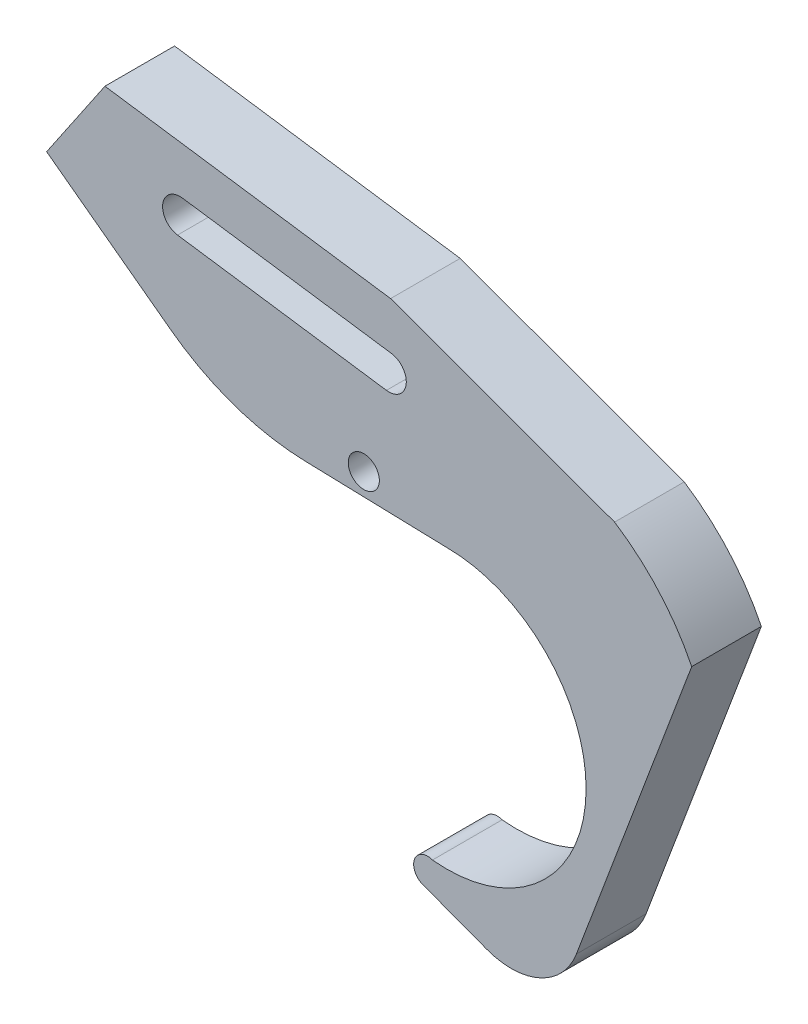
ISO-10303-21;
HEADER;
FILE_DESCRIPTION(('STEP AP214'),'2;1');
FILE_NAME('part.step','',(''),(''),'','','');
FILE_SCHEMA(('AUTOMOTIVE_DESIGN { 1 0 10303 214 1 1 1 1 }'));
ENDSEC;
DATA;
#1=APPLICATION_CONTEXT('core data for automotive mechanical design processes');
#2=APPLICATION_PROTOCOL_DEFINITION('international standard','automotive_design',2000,#1);
#3=PRODUCT_CONTEXT('',#1,'mechanical');
#4=PRODUCT('Part','Part','',(#3));
#5=PRODUCT_RELATED_PRODUCT_CATEGORY('part','',(#4));
#6=PRODUCT_DEFINITION_FORMATION('','',#4);
#7=PRODUCT_DEFINITION_CONTEXT('part definition',#1,'design');
#8=PRODUCT_DEFINITION('design','',#6,#7);
#9=PRODUCT_DEFINITION_SHAPE('','',#8);
#10=(LENGTH_UNIT() NAMED_UNIT(*) SI_UNIT(.MILLI.,.METRE.));
#11=(NAMED_UNIT(*) PLANE_ANGLE_UNIT() SI_UNIT($,.RADIAN.));
#12=(NAMED_UNIT(*) SI_UNIT($,.STERADIAN.) SOLID_ANGLE_UNIT());
#13=UNCERTAINTY_MEASURE_WITH_UNIT(LENGTH_MEASURE(1.E-05),#10,'distance_accuracy_value','');
#14=(GEOMETRIC_REPRESENTATION_CONTEXT(3) GLOBAL_UNCERTAINTY_ASSIGNED_CONTEXT((#13)) GLOBAL_UNIT_ASSIGNED_CONTEXT((#10,
#11,#12)) REPRESENTATION_CONTEXT('',''));
#15=CARTESIAN_POINT('',(0.,0.,0.));
#16=DIRECTION('',(0.,0.,1.));
#17=DIRECTION('',(1.,0.,0.));
#18=AXIS2_PLACEMENT_3D('',#15,#16,#17);
#19=CARTESIAN_POINT('',(44.5003851994904,32.9740608625398,12.7));
#20=DIRECTION('',(0.,0.,1.));
#21=DIRECTION('',(1.,0.,0.));
#22=AXIS2_PLACEMENT_3D('',#19,#20,#21);
#23=PLANE('',#22);
#24=DIRECTION('',(-0.56150006442407,-0.827476693116952,0.));
#25=VECTOR('',#24,1.);
#26=CARTESIAN_POINT('',(-37.4522239692314,73.1063917914295,12.7));
#27=LINE('',#26,#25);
#28=CARTESIAN_POINT('',(-26.824587007676,88.7682277301582,12.7));
#29=VERTEX_POINT('',#28);
#30=CARTESIAN_POINT('',(-37.4522239692314,73.1063917914295,12.7));
#31=VERTEX_POINT('',#30);
#32=EDGE_CURVE('E211',#29,#31,#27,.T.);
#33=ORIENTED_EDGE('',*,*,#32,.T.);
#34=DIRECTION('',(0.802882803656803,-0.596136900042424,0.));
#35=VECTOR('',#34,1.);
#36=CARTESIAN_POINT('',(-14.8197594877197,56.3018878776853,12.7));
#37=LINE('',#36,#35);
#38=CARTESIAN_POINT('',(-14.8197594877197,56.3018878776853,12.7));
#39=VERTEX_POINT('',#38);
#40=EDGE_CURVE('E215',#31,#39,#37,.T.);
#41=ORIENTED_EDGE('',*,*,#40,.T.);
#42=CARTESIAN_POINT('',(10.9214318561123,90.9703673395859,12.7));
#43=DIRECTION('',(0.,0.,1.));
#44=DIRECTION('',(-1.,0.,0.));
#45=AXIS2_PLACEMENT_3D('',#42,#43,#44);
#46=CIRCLE('',#45,43.18);
#47=CARTESIAN_POINT('',(9.6960610088386,47.8077577534331,12.7));
#48=VERTEX_POINT('',#47);
#49=EDGE_CURVE('E219',#39,#48,#46,.T.);
#50=ORIENTED_EDGE('',*,*,#49,.T.);
#51=DIRECTION('',(0.999597257669125,-0.0283782039665097,0.));
#52=VECTOR('',#51,1.);
#53=CARTESIAN_POINT('',(35.5396463925959,47.074067728156,12.7));
#54=LINE('',#53,#52);
#55=CARTESIAN_POINT('',(35.5396463925959,47.074067728156,12.7));
#56=VERTEX_POINT('',#55);
#57=EDGE_CURVE('E222',#48,#56,#54,.T.);
#58=ORIENTED_EDGE('',*,*,#57,.T.);
#59=CARTESIAN_POINT('',(35.5396463925959,21.674067728156,12.7));
#60=DIRECTION('',(0.,0.,-1.));
#61=DIRECTION('',(1.,0.,0.));
#62=AXIS2_PLACEMENT_3D('',#59,#60,#61);
#63=CIRCLE('',#62,25.4);
#64=CARTESIAN_POINT('',(32.9208078840981,-3.59056535578976,12.7));
#65=VERTEX_POINT('',#64);
#66=EDGE_CURVE('E225',#56,#65,#63,.T.);
#67=ORIENTED_EDGE('',*,*,#66,.T.);
#68=CARTESIAN_POINT('',(32.0265492652429,-5.9679381752279,12.7));
#69=DIRECTION('',(0.,0.,1.));
#70=DIRECTION('',(1.,0.,0.));
#71=AXIS2_PLACEMENT_3D('',#68,#69,#70);
#72=CIRCLE('',#71,2.54);
#73=CARTESIAN_POINT('',(31.1322906463877,-8.34531099466603,12.7));
#74=VERTEX_POINT('',#73);
#75=EDGE_CURVE('E228',#65,#74,#72,.T.);
#76=ORIENTED_EDGE('',*,*,#75,.T.);
#77=DIRECTION('',(0.935973550959895,-0.35207032238393,0.));
#78=VECTOR('',#77,1.);
#79=CARTESIAN_POINT('',(31.1322906463877,-8.34531099466603,12.7));
#80=LINE('',#79,#78);
#81=CARTESIAN_POINT('',(42.8078257572779,-12.7371118166874,12.7));
#82=VERTEX_POINT('',#81);
#83=EDGE_CURVE('E231',#74,#82,#80,.T.);
#84=ORIENTED_EDGE('',*,*,#83,.T.);
#85=CARTESIAN_POINT('',(47.2791188515538,-0.850247719496773,12.7));
#86=DIRECTION('',(0.,0.,1.));
#87=DIRECTION('',(-1.,0.,0.));
#88=AXIS2_PLACEMENT_3D('',#85,#86,#87);
#89=CIRCLE('',#88,12.7);
#90=CARTESIAN_POINT('',(59.1659829487444,-5.32154081377268,12.7));
#91=VERTEX_POINT('',#90);
#92=EDGE_CURVE('E234',#82,#91,#89,.T.);
#93=ORIENTED_EDGE('',*,*,#92,.T.);
#94=DIRECTION('',(0.352070322383929,0.935973550959896,0.));
#95=VECTOR('',#94,1.);
#96=CARTESIAN_POINT('',(80.2010589768232,50.5998861085522,12.7));
#97=LINE('',#96,#95);
#98=CARTESIAN_POINT('',(80.2010589768232,50.5998861085522,12.7));
#99=VERTEX_POINT('',#98);
#100=EDGE_CURVE('E237',#91,#99,#97,.T.);
#101=ORIENTED_EDGE('',*,*,#100,.T.);
#102=CARTESIAN_POINT('',(44.5003851994904,32.9740608625398,12.7));
#103=DIRECTION('',(0.,0.,1.));
#104=DIRECTION('',(1.,0.,0.));
#105=AXIS2_PLACEMENT_3D('',#102,#103,#104);
#106=CIRCLE('',#105,39.814668449687);
#107=CARTESIAN_POINT('',(66.1342163360838,66.3983809620103,12.7));
#108=VERTEX_POINT('',#107);
#109=EDGE_CURVE('E240',#99,#108,#106,.T.);
#110=ORIENTED_EDGE('',*,*,#109,.T.);
#111=DIRECTION('',(-0.93966143887381,0.342105802776861,0.));
#112=VECTOR('',#111,1.);
#113=CARTESIAN_POINT('',(66.1342163360838,66.3983809620103,12.7));
#114=LINE('',#113,#112);
#115=CARTESIAN_POINT('',(25.2746101384072,81.2742796645851,12.7));
#116=VERTEX_POINT('',#115);
#117=EDGE_CURVE('E243',#108,#116,#114,.T.);
#118=ORIENTED_EDGE('',*,*,#117,.T.);
#119=DIRECTION('',(-0.989812837536592,0.142374669965416,0.));
#120=VECTOR('',#119,1.);
#121=CARTESIAN_POINT('',(-26.824587007676,88.7682277301582,12.7));
#122=LINE('',#121,#120);
#123=EDGE_CURVE('E246',#116,#29,#122,.T.);
#124=ORIENTED_EDGE('',*,*,#123,.T.);
#125=EDGE_LOOP('',(#33,#41,#50,#58,#67,#76,#84,#93,#101,#110,#118,#124));
#126=FACE_BOUND('',#125,.T.);
#127=CARTESIAN_POINT('',(20.3901427657872,51.5029722152476,12.7));
#128=DIRECTION('',(0.,0.,1.));
#129=DIRECTION('',(1.,0.,0.));
#130=AXIS2_PLACEMENT_3D('',#127,#128,#129);
#131=CIRCLE('',#130,2.83838254770481);
#132=CARTESIAN_POINT('',(23.228525313492,51.5029722152476,12.7));
#133=VERTEX_POINT('',#132);
#134=EDGE_CURVE('E203',#133,#133,#131,.T.);
#135=ORIENTED_EDGE('',*,*,#134,.F.);
#136=EDGE_LOOP('',(#135));
#137=FACE_BOUND('',#136,.T.);
#138=DIRECTION('',(-0.989812837536592,0.142374669965415,0.));
#139=VECTOR('',#138,1.);
#140=CARTESIAN_POINT('',(25.4210368933711,72.6836924803676,12.7));
#141=LINE('',#140,#139);
#142=CARTESIAN_POINT('',(25.4210368933711,72.6836924803676,12.7));
#143=VERTEX_POINT('',#142);
#144=CARTESIAN_POINT('',(-12.6789631066289,78.1639961498801,12.7));
#145=VERTEX_POINT('',#144);
#146=EDGE_CURVE('E164',#143,#145,#141,.T.);
#147=ORIENTED_EDGE('',*,*,#146,.F.);
#148=CARTESIAN_POINT('',(24.9689973162309,69.5410367211889,12.7));
#149=DIRECTION('',(0.,0.,1.));
#150=DIRECTION('',(1.,0.,0.));
#151=AXIS2_PLACEMENT_3D('',#148,#149,#150);
#152=CIRCLE('',#151,3.17499999999999);
#153=CARTESIAN_POINT('',(24.5169577390907,66.3983809620103,12.7));
#154=VERTEX_POINT('',#153);
#155=EDGE_CURVE('E155',#154,#143,#152,.T.);
#156=ORIENTED_EDGE('',*,*,#155,.F.);
#157=DIRECTION('',(0.989812837536592,-0.142374669965415,0.));
#158=VECTOR('',#157,1.);
#159=CARTESIAN_POINT('',(24.5169577390907,66.3983809620103,12.7));
#160=LINE('',#159,#158);
#161=CARTESIAN_POINT('',(-13.5830422609093,71.8786846315227,12.7));
#162=VERTEX_POINT('',#161);
#163=EDGE_CURVE('E181',#162,#154,#160,.T.);
#164=ORIENTED_EDGE('',*,*,#163,.F.);
#165=CARTESIAN_POINT('',(-13.1310026837691,75.0213403907014,12.7));
#166=DIRECTION('',(0.,0.,1.));
#167=DIRECTION('',(1.,0.,0.));
#168=AXIS2_PLACEMENT_3D('',#165,#166,#167);
#169=CIRCLE('',#168,3.17499999999999);
#170=EDGE_CURVE('E177',#145,#162,#169,.T.);
#171=ORIENTED_EDGE('',*,*,#170,.F.);
#172=EDGE_LOOP('',(#147,#156,#164,#171));
#173=FACE_BOUND('',#172,.T.);
#174=ADVANCED_FACE('F41',(#126,#137,#173),#23,.T.);
#175=CARTESIAN_POINT('',(44.5003851994904,32.9740608625398,0.));
#176=DIRECTION('',(0.,0.,1.));
#177=DIRECTION('',(1.,0.,0.));
#178=AXIS2_PLACEMENT_3D('',#175,#176,#177);
#179=PLANE('',#178);
#180=CARTESIAN_POINT('',(20.3901427657872,51.5029722152476,0.));
#181=DIRECTION('',(0.,0.,1.));
#182=DIRECTION('',(1.,0.,0.));
#183=AXIS2_PLACEMENT_3D('',#180,#181,#182);
#184=CIRCLE('',#183,2.83838254770481);
#185=CARTESIAN_POINT('',(23.228525313492,51.5029722152476,0.));
#186=VERTEX_POINT('',#185);
#187=EDGE_CURVE('E173',#186,#186,#184,.T.);
#188=ORIENTED_EDGE('',*,*,#187,.T.);
#189=EDGE_LOOP('',(#188));
#190=FACE_BOUND('',#189,.T.);
#191=DIRECTION('',(-0.56150006442407,-0.827476693116952,0.));
#192=VECTOR('',#191,1.);
#193=CARTESIAN_POINT('',(-37.4522239692314,73.1063917914295,0.));
#194=LINE('',#193,#192);
#195=CARTESIAN_POINT('',(-26.824587007676,88.7682277301582,0.));
#196=VERTEX_POINT('',#195);
#197=CARTESIAN_POINT('',(-37.4522239692314,73.1063917914295,0.));
#198=VERTEX_POINT('',#197);
#199=EDGE_CURVE('E207',#196,#198,#194,.T.);
#200=ORIENTED_EDGE('',*,*,#199,.F.);
#201=DIRECTION('',(-0.989812837536592,0.142374669965416,0.));
#202=VECTOR('',#201,1.);
#203=CARTESIAN_POINT('',(-26.824587007676,88.7682277301582,0.));
#204=LINE('',#203,#202);
#205=CARTESIAN_POINT('',(25.2746101384072,81.2742796645851,0.));
#206=VERTEX_POINT('',#205);
#207=EDGE_CURVE('E216',#206,#196,#204,.T.);
#208=ORIENTED_EDGE('',*,*,#207,.F.);
#209=DIRECTION('',(-0.93966143887381,0.342105802776861,0.));
#210=VECTOR('',#209,1.);
#211=CARTESIAN_POINT('',(66.1342163360838,66.3983809620103,0.));
#212=LINE('',#211,#210);
#213=CARTESIAN_POINT('',(66.1342163360838,66.3983809620103,0.));
#214=VERTEX_POINT('',#213);
#215=EDGE_CURVE('E281',#214,#206,#212,.T.);
#216=ORIENTED_EDGE('',*,*,#215,.F.);
#217=CARTESIAN_POINT('',(44.5003851994904,32.9740608625398,0.));
#218=DIRECTION('',(0.,0.,1.));
#219=DIRECTION('',(1.,0.,0.));
#220=AXIS2_PLACEMENT_3D('',#217,#218,#219);
#221=CIRCLE('',#220,39.814668449687);
#222=CARTESIAN_POINT('',(80.2010589768232,50.5998861085522,0.));
#223=VERTEX_POINT('',#222);
#224=EDGE_CURVE('E278',#223,#214,#221,.T.);
#225=ORIENTED_EDGE('',*,*,#224,.F.);
#226=DIRECTION('',(0.352070322383929,0.935973550959896,0.));
#227=VECTOR('',#226,1.);
#228=CARTESIAN_POINT('',(80.2010589768232,50.5998861085522,0.));
#229=LINE('',#228,#227);
#230=CARTESIAN_POINT('',(59.1659829487444,-5.32154081377268,0.));
#231=VERTEX_POINT('',#230);
#232=EDGE_CURVE('E275',#231,#223,#229,.T.);
#233=ORIENTED_EDGE('',*,*,#232,.F.);
#234=CARTESIAN_POINT('',(47.2791188515538,-0.850247719496773,0.));
#235=DIRECTION('',(0.,0.,1.));
#236=DIRECTION('',(-1.,0.,0.));
#237=AXIS2_PLACEMENT_3D('',#234,#235,#236);
#238=CIRCLE('',#237,12.7);
#239=CARTESIAN_POINT('',(42.8078257572779,-12.7371118166874,0.));
#240=VERTEX_POINT('',#239);
#241=EDGE_CURVE('E272',#240,#231,#238,.T.);
#242=ORIENTED_EDGE('',*,*,#241,.F.);
#243=DIRECTION('',(0.935973550959895,-0.35207032238393,0.));
#244=VECTOR('',#243,1.);
#245=CARTESIAN_POINT('',(31.1322906463877,-8.34531099466603,0.));
#246=LINE('',#245,#244);
#247=CARTESIAN_POINT('',(31.1322906463877,-8.34531099466603,0.));
#248=VERTEX_POINT('',#247);
#249=EDGE_CURVE('E269',#248,#240,#246,.T.);
#250=ORIENTED_EDGE('',*,*,#249,.F.);
#251=CARTESIAN_POINT('',(32.0265492652429,-5.9679381752279,0.));
#252=DIRECTION('',(0.,0.,1.));
#253=DIRECTION('',(1.,0.,0.));
#254=AXIS2_PLACEMENT_3D('',#251,#252,#253);
#255=CIRCLE('',#254,2.54);
#256=CARTESIAN_POINT('',(32.9208078840981,-3.59056535578976,0.));
#257=VERTEX_POINT('',#256);
#258=EDGE_CURVE('E266',#257,#248,#255,.T.);
#259=ORIENTED_EDGE('',*,*,#258,.F.);
#260=CARTESIAN_POINT('',(35.5396463925959,21.674067728156,0.));
#261=DIRECTION('',(0.,0.,-1.));
#262=DIRECTION('',(-1.,0.,0.));
#263=AXIS2_PLACEMENT_3D('',#260,#261,#262);
#264=CIRCLE('',#263,25.4);
#265=CARTESIAN_POINT('',(35.5396463925959,47.074067728156,0.));
#266=VERTEX_POINT('',#265);
#267=EDGE_CURVE('E263',#266,#257,#264,.T.);
#268=ORIENTED_EDGE('',*,*,#267,.F.);
#269=DIRECTION('',(0.999597257669125,-0.0283782039665097,0.));
#270=VECTOR('',#269,1.);
#271=CARTESIAN_POINT('',(35.5396463925959,47.074067728156,0.));
#272=LINE('',#271,#270);
#273=CARTESIAN_POINT('',(9.6960610088386,47.8077577534331,0.));
#274=VERTEX_POINT('',#273);
#275=EDGE_CURVE('E259',#274,#266,#272,.T.);
#276=ORIENTED_EDGE('',*,*,#275,.F.);
#277=CARTESIAN_POINT('',(10.9214318561123,90.9703673395859,0.));
#278=DIRECTION('',(0.,0.,1.));
#279=DIRECTION('',(-1.,0.,0.));
#280=AXIS2_PLACEMENT_3D('',#277,#278,#279);
#281=CIRCLE('',#280,43.18);
#282=CARTESIAN_POINT('',(-14.8197594877197,56.3018878776853,0.));
#283=VERTEX_POINT('',#282);
#284=EDGE_CURVE('E256',#283,#274,#281,.T.);
#285=ORIENTED_EDGE('',*,*,#284,.F.);
#286=DIRECTION('',(0.802882803656803,-0.596136900042424,0.));
#287=VECTOR('',#286,1.);
#288=CARTESIAN_POINT('',(-14.8197594877197,56.3018878776853,0.));
#289=LINE('',#288,#287);
#290=EDGE_CURVE('E253',#198,#283,#289,.T.);
#291=ORIENTED_EDGE('',*,*,#290,.F.);
#292=EDGE_LOOP('',(#200,#208,#216,#225,#233,#242,#250,#259,#268,#276,#285,#291));
#293=FACE_BOUND('',#292,.T.);
#294=CARTESIAN_POINT('',(24.9689973162309,69.5410367211889,0.));
#295=DIRECTION('',(0.,0.,1.));
#296=DIRECTION('',(1.,0.,0.));
#297=AXIS2_PLACEMENT_3D('',#294,#295,#296);
#298=CIRCLE('',#297,3.17499999999999);
#299=CARTESIAN_POINT('',(24.5169577390907,66.3983809620103,0.));
#300=VERTEX_POINT('',#299);
#301=CARTESIAN_POINT('',(25.4210368933711,72.6836924803676,0.));
#302=VERTEX_POINT('',#301);
#303=EDGE_CURVE('E65',#300,#302,#298,.T.);
#304=ORIENTED_EDGE('',*,*,#303,.T.);
#305=DIRECTION('',(-0.989812837536592,0.142374669965415,0.));
#306=VECTOR('',#305,1.);
#307=CARTESIAN_POINT('',(25.4210368933711,72.6836924803676,0.));
#308=LINE('',#307,#306);
#309=CARTESIAN_POINT('',(-12.6789631066289,78.1639961498801,0.));
#310=VERTEX_POINT('',#309);
#311=EDGE_CURVE('E171',#302,#310,#308,.T.);
#312=ORIENTED_EDGE('',*,*,#311,.T.);
#313=CARTESIAN_POINT('',(-13.1310026837691,75.0213403907014,0.));
#314=DIRECTION('',(0.,0.,1.));
#315=DIRECTION('',(1.,0.,0.));
#316=AXIS2_PLACEMENT_3D('',#313,#314,#315);
#317=CIRCLE('',#316,3.17499999999999);
#318=CARTESIAN_POINT('',(-13.5830422609093,71.8786846315227,0.));
#319=VERTEX_POINT('',#318);
#320=EDGE_CURVE('E190',#310,#319,#317,.T.);
#321=ORIENTED_EDGE('',*,*,#320,.T.);
#322=DIRECTION('',(0.989812837536592,-0.142374669965415,0.));
#323=VECTOR('',#322,1.);
#324=CARTESIAN_POINT('',(24.5169577390907,66.3983809620103,0.));
#325=LINE('',#324,#323);
#326=EDGE_CURVE('E165',#319,#300,#325,.T.);
#327=ORIENTED_EDGE('',*,*,#326,.T.);
#328=EDGE_LOOP('',(#304,#312,#321,#327));
#329=FACE_BOUND('',#328,.T.);
#330=ADVANCED_FACE('F336',(#190,#293,#329),#179,.F.);
#331=CARTESIAN_POINT('',(-37.4522239692314,73.1063917914295,12.7));
#332=DIRECTION('',(0.827476693116952,-0.56150006442407,0.));
#333=DIRECTION('',(0.56150006442407,0.827476693116952,0.));
#334=AXIS2_PLACEMENT_3D('',#331,#332,#333);
#335=PLANE('',#334);
#336=ORIENTED_EDGE('',*,*,#199,.T.);
#337=DIRECTION('',(0.,0.,-1.));
#338=VECTOR('',#337,1.);
#339=CARTESIAN_POINT('',(-37.4522239692314,73.1063917914295,12.7));
#340=LINE('',#339,#338);
#341=EDGE_CURVE('E11',#31,#198,#340,.T.);
#342=ORIENTED_EDGE('',*,*,#341,.F.);
#343=ORIENTED_EDGE('',*,*,#32,.F.);
#344=DIRECTION('',(0.,0.,-1.));
#345=VECTOR('',#344,1.);
#346=CARTESIAN_POINT('',(-26.824587007676,88.7682277301582,12.7));
#347=LINE('',#346,#345);
#348=EDGE_CURVE('E249',#29,#196,#347,.T.);
#349=ORIENTED_EDGE('',*,*,#348,.T.);
#350=EDGE_LOOP('',(#336,#342,#343,#349));
#351=FACE_BOUND('',#350,.T.);
#352=ADVANCED_FACE('F43',(#351),#335,.F.);
#353=CARTESIAN_POINT('',(-14.8197594877197,56.3018878776853,12.7));
#354=DIRECTION('',(0.596136900042424,0.802882803656803,0.));
#355=DIRECTION('',(-0.802882803656803,0.596136900042425,0.));
#356=AXIS2_PLACEMENT_3D('',#353,#354,#355);
#357=PLANE('',#356);
#358=ORIENTED_EDGE('',*,*,#290,.T.);
#359=DIRECTION('',(0.,0.,-1.));
#360=VECTOR('',#359,1.);
#361=CARTESIAN_POINT('',(-14.8197594877197,56.3018878776853,12.7));
#362=LINE('',#361,#360);
#363=EDGE_CURVE('E50',#39,#283,#362,.T.);
#364=ORIENTED_EDGE('',*,*,#363,.F.);
#365=ORIENTED_EDGE('',*,*,#40,.F.);
#366=ORIENTED_EDGE('',*,*,#341,.T.);
#367=EDGE_LOOP('',(#358,#364,#365,#366));
#368=FACE_BOUND('',#367,.T.);
#369=ADVANCED_FACE('F353',(#368),#357,.F.);
#370=CARTESIAN_POINT('',(10.9214318561123,90.9703673395859,12.7));
#371=DIRECTION('',(0.,0.,-1.));
#372=DIRECTION('',(-1.,0.,0.));
#373=AXIS2_PLACEMENT_3D('',#370,#371,#372);
#374=CYLINDRICAL_SURFACE('',#373,43.18);
#375=ORIENTED_EDGE('',*,*,#284,.T.);
#376=DIRECTION('',(0.,0.,-1.));
#377=VECTOR('',#376,1.);
#378=CARTESIAN_POINT('',(9.6960610088386,47.8077577534331,12.7));
#379=LINE('',#378,#377);
#380=EDGE_CURVE('E321',#48,#274,#379,.T.);
#381=ORIENTED_EDGE('',*,*,#380,.F.);
#382=ORIENTED_EDGE('',*,*,#49,.F.);
#383=ORIENTED_EDGE('',*,*,#363,.T.);
#384=EDGE_LOOP('',(#375,#381,#382,#383));
#385=FACE_BOUND('',#384,.T.);
#386=ADVANCED_FACE('F330',(#385),#374,.T.);
#387=CARTESIAN_POINT('',(35.5396463925959,47.074067728156,12.7));
#388=DIRECTION('',(0.0283782039665097,0.999597257669125,0.));
#389=DIRECTION('',(-0.999597257669125,0.0283782039665097,0.));
#390=AXIS2_PLACEMENT_3D('',#387,#388,#389);
#391=PLANE('',#390);
#392=ORIENTED_EDGE('',*,*,#275,.T.);
#393=DIRECTION('',(0.,0.,-1.));
#394=VECTOR('',#393,1.);
#395=CARTESIAN_POINT('',(35.5396463925959,47.074067728156,12.7));
#396=LINE('',#395,#394);
#397=EDGE_CURVE('E317',#56,#266,#396,.T.);
#398=ORIENTED_EDGE('',*,*,#397,.F.);
#399=ORIENTED_EDGE('',*,*,#57,.F.);
#400=ORIENTED_EDGE('',*,*,#380,.T.);
#401=EDGE_LOOP('',(#392,#398,#399,#400));
#402=FACE_BOUND('',#401,.T.);
#403=ADVANCED_FACE('F341',(#402),#391,.F.);
#404=CARTESIAN_POINT('',(35.5396463925959,21.674067728156,12.7));
#405=DIRECTION('',(0.,0.,-1.));
#406=DIRECTION('',(-1.,0.,0.));
#407=AXIS2_PLACEMENT_3D('',#404,#405,#406);
#408=CYLINDRICAL_SURFACE('',#407,25.4);
#409=ORIENTED_EDGE('',*,*,#267,.T.);
#410=DIRECTION('',(0.,0.,-1.));
#411=VECTOR('',#410,1.);
#412=CARTESIAN_POINT('',(32.9208078840981,-3.59056535578976,12.7));
#413=LINE('',#412,#411);
#414=EDGE_CURVE('E313',#65,#257,#413,.T.);
#415=ORIENTED_EDGE('',*,*,#414,.F.);
#416=ORIENTED_EDGE('',*,*,#66,.F.);
#417=ORIENTED_EDGE('',*,*,#397,.T.);
#418=EDGE_LOOP('',(#409,#415,#416,#417));
#419=FACE_BOUND('',#418,.T.);
#420=ADVANCED_FACE('F345',(#419),#408,.F.);
#421=CARTESIAN_POINT('',(32.0265492652429,-5.9679381752279,12.7));
#422=DIRECTION('',(0.,0.,-1.));
#423=DIRECTION('',(-1.,0.,0.));
#424=AXIS2_PLACEMENT_3D('',#421,#422,#423);
#425=CYLINDRICAL_SURFACE('',#424,2.54);
#426=ORIENTED_EDGE('',*,*,#258,.T.);
#427=DIRECTION('',(0.,0.,-1.));
#428=VECTOR('',#427,1.);
#429=CARTESIAN_POINT('',(31.1322906463877,-8.34531099466603,12.7));
#430=LINE('',#429,#428);
#431=EDGE_CURVE('E309',#74,#248,#430,.T.);
#432=ORIENTED_EDGE('',*,*,#431,.F.);
#433=ORIENTED_EDGE('',*,*,#75,.F.);
#434=ORIENTED_EDGE('',*,*,#414,.T.);
#435=EDGE_LOOP('',(#426,#432,#433,#434));
#436=FACE_BOUND('',#435,.T.);
#437=ADVANCED_FACE('F386',(#436),#425,.T.);
#438=CARTESIAN_POINT('',(31.1322906463877,-8.34531099466603,12.7));
#439=DIRECTION('',(0.35207032238393,0.935973550959895,0.));
#440=DIRECTION('',(-0.935973550959895,0.35207032238393,0.));
#441=AXIS2_PLACEMENT_3D('',#438,#439,#440);
#442=PLANE('',#441);
#443=ORIENTED_EDGE('',*,*,#249,.T.);
#444=DIRECTION('',(0.,0.,-1.));
#445=VECTOR('',#444,1.);
#446=CARTESIAN_POINT('',(42.8078257572779,-12.7371118166874,12.7));
#447=LINE('',#446,#445);
#448=EDGE_CURVE('E305',#82,#240,#447,.T.);
#449=ORIENTED_EDGE('',*,*,#448,.F.);
#450=ORIENTED_EDGE('',*,*,#83,.F.);
#451=ORIENTED_EDGE('',*,*,#431,.T.);
#452=EDGE_LOOP('',(#443,#449,#450,#451));
#453=FACE_BOUND('',#452,.T.);
#454=ADVANCED_FACE('F384',(#453),#442,.F.);
#455=CARTESIAN_POINT('',(47.2791188515538,-0.850247719496773,12.7));
#456=DIRECTION('',(0.,0.,-1.));
#457=DIRECTION('',(-1.,0.,0.));
#458=AXIS2_PLACEMENT_3D('',#455,#456,#457);
#459=CYLINDRICAL_SURFACE('',#458,12.7);
#460=ORIENTED_EDGE('',*,*,#241,.T.);
#461=DIRECTION('',(0.,0.,-1.));
#462=VECTOR('',#461,1.);
#463=CARTESIAN_POINT('',(59.1659829487444,-5.32154081377268,12.7));
#464=LINE('',#463,#462);
#465=EDGE_CURVE('E301',#91,#231,#464,.T.);
#466=ORIENTED_EDGE('',*,*,#465,.F.);
#467=ORIENTED_EDGE('',*,*,#92,.F.);
#468=ORIENTED_EDGE('',*,*,#448,.T.);
#469=EDGE_LOOP('',(#460,#466,#467,#468));
#470=FACE_BOUND('',#469,.T.);
#471=ADVANCED_FACE('F380',(#470),#459,.T.);
#472=CARTESIAN_POINT('',(80.2010589768232,50.5998861085522,12.7));
#473=DIRECTION('',(-0.935973550959895,0.352070322383929,0.));
#474=DIRECTION('',(-0.352070322383929,-0.935973550959896,0.));
#475=AXIS2_PLACEMENT_3D('',#472,#473,#474);
#476=PLANE('',#475);
#477=ORIENTED_EDGE('',*,*,#232,.T.);
#478=DIRECTION('',(0.,0.,-1.));
#479=VECTOR('',#478,1.);
#480=CARTESIAN_POINT('',(80.2010589768232,50.5998861085522,12.7));
#481=LINE('',#480,#479);
#482=EDGE_CURVE('E297',#99,#223,#481,.T.);
#483=ORIENTED_EDGE('',*,*,#482,.F.);
#484=ORIENTED_EDGE('',*,*,#100,.F.);
#485=ORIENTED_EDGE('',*,*,#465,.T.);
#486=EDGE_LOOP('',(#477,#483,#484,#485));
#487=FACE_BOUND('',#486,.T.);
#488=ADVANCED_FACE('F375',(#487),#476,.F.);
#489=CARTESIAN_POINT('',(44.5003851994904,32.9740608625398,12.7));
#490=DIRECTION('',(0.,0.,-1.));
#491=DIRECTION('',(-1.,0.,0.));
#492=AXIS2_PLACEMENT_3D('',#489,#490,#491);
#493=CYLINDRICAL_SURFACE('',#492,39.814668449687);
#494=ORIENTED_EDGE('',*,*,#224,.T.);
#495=DIRECTION('',(0.,0.,-1.));
#496=VECTOR('',#495,1.);
#497=CARTESIAN_POINT('',(66.1342163360838,66.3983809620103,12.7));
#498=LINE('',#497,#496);
#499=EDGE_CURVE('E293',#108,#214,#498,.T.);
#500=ORIENTED_EDGE('',*,*,#499,.F.);
#501=ORIENTED_EDGE('',*,*,#109,.F.);
#502=ORIENTED_EDGE('',*,*,#482,.T.);
#503=EDGE_LOOP('',(#494,#500,#501,#502));
#504=FACE_BOUND('',#503,.T.);
#505=ADVANCED_FACE('F369',(#504),#493,.T.);
#506=CARTESIAN_POINT('',(66.1342163360838,66.3983809620103,12.7));
#507=DIRECTION('',(-0.342105802776861,-0.93966143887381,0.));
#508=DIRECTION('',(0.939661438873811,-0.342105802776861,0.));
#509=AXIS2_PLACEMENT_3D('',#506,#507,#508);
#510=PLANE('',#509);
#511=ORIENTED_EDGE('',*,*,#215,.T.);
#512=DIRECTION('',(0.,0.,-1.));
#513=VECTOR('',#512,1.);
#514=CARTESIAN_POINT('',(25.2746101384072,81.2742796645851,12.7));
#515=LINE('',#514,#513);
#516=EDGE_CURVE('E289',#116,#206,#515,.T.);
#517=ORIENTED_EDGE('',*,*,#516,.F.);
#518=ORIENTED_EDGE('',*,*,#117,.F.);
#519=ORIENTED_EDGE('',*,*,#499,.T.);
#520=EDGE_LOOP('',(#511,#517,#518,#519));
#521=FACE_BOUND('',#520,.T.);
#522=ADVANCED_FACE('F365',(#521),#510,.F.);
#523=CARTESIAN_POINT('',(-26.824587007676,88.7682277301582,12.7));
#524=DIRECTION('',(-0.142374669965416,-0.989812837536592,0.));
#525=DIRECTION('',(0.989812837536592,-0.142374669965416,0.));
#526=AXIS2_PLACEMENT_3D('',#523,#524,#525);
#527=PLANE('',#526);
#528=ORIENTED_EDGE('',*,*,#207,.T.);
#529=ORIENTED_EDGE('',*,*,#348,.F.);
#530=ORIENTED_EDGE('',*,*,#123,.F.);
#531=ORIENTED_EDGE('',*,*,#516,.T.);
#532=EDGE_LOOP('',(#528,#529,#530,#531));
#533=FACE_BOUND('',#532,.T.);
#534=ADVANCED_FACE('F360',(#533),#527,.F.);
#535=CARTESIAN_POINT('',(20.3901427657872,51.5029722152476,12.7));
#536=DIRECTION('',(0.,0.,-1.));
#537=DIRECTION('',(-1.,0.,0.));
#538=AXIS2_PLACEMENT_3D('',#535,#536,#537);
#539=CYLINDRICAL_SURFACE('',#538,2.83838254770481);
#540=ORIENTED_EDGE('',*,*,#134,.T.);
#541=EDGE_LOOP('',(#540));
#542=FACE_BOUND('',#541,.T.);
#543=ORIENTED_EDGE('',*,*,#187,.F.);
#544=EDGE_LOOP('',(#543));
#545=FACE_BOUND('',#544,.T.);
#546=ADVANCED_FACE('F403',(#542,#545),#539,.F.);
#547=CARTESIAN_POINT('',(24.9689973162309,69.5410367211889,12.7));
#548=DIRECTION('',(0.,0.,-1.));
#549=DIRECTION('',(-1.,0.,0.));
#550=AXIS2_PLACEMENT_3D('',#547,#548,#549);
#551=CYLINDRICAL_SURFACE('',#550,3.17499999999999);
#552=ORIENTED_EDGE('',*,*,#303,.F.);
#553=DIRECTION('',(0.,0.,-1.));
#554=VECTOR('',#553,1.);
#555=CARTESIAN_POINT('',(24.5169577390907,66.3983809620103,12.7));
#556=LINE('',#555,#554);
#557=EDGE_CURVE('E159',#154,#300,#556,.T.);
#558=ORIENTED_EDGE('',*,*,#557,.F.);
#559=ORIENTED_EDGE('',*,*,#155,.T.);
#560=DIRECTION('',(0.,0.,-1.));
#561=VECTOR('',#560,1.);
#562=CARTESIAN_POINT('',(25.4210368933711,72.6836924803676,12.7));
#563=LINE('',#562,#561);
#564=EDGE_CURVE('E158',#143,#302,#563,.T.);
#565=ORIENTED_EDGE('',*,*,#564,.T.);
#566=EDGE_LOOP('',(#552,#558,#559,#565));
#567=FACE_BOUND('',#566,.T.);
#568=ADVANCED_FACE('F157',(#567),#551,.F.);
#569=CARTESIAN_POINT('',(25.4210368933711,72.6836924803676,12.7));
#570=DIRECTION('',(-0.142374669965415,-0.989812837536592,0.));
#571=DIRECTION('',(0.989812837536592,-0.142374669965415,0.));
#572=AXIS2_PLACEMENT_3D('',#569,#570,#571);
#573=PLANE('',#572);
#574=ORIENTED_EDGE('',*,*,#311,.F.);
#575=ORIENTED_EDGE('',*,*,#564,.F.);
#576=ORIENTED_EDGE('',*,*,#146,.T.);
#577=DIRECTION('',(0.,0.,-1.));
#578=VECTOR('',#577,1.);
#579=CARTESIAN_POINT('',(-12.6789631066289,78.1639961498801,12.7));
#580=LINE('',#579,#578);
#581=EDGE_CURVE('E174',#145,#310,#580,.T.);
#582=ORIENTED_EDGE('',*,*,#581,.T.);
#583=EDGE_LOOP('',(#574,#575,#576,#582));
#584=FACE_BOUND('',#583,.T.);
#585=ADVANCED_FACE('F168',(#584),#573,.T.);
#586=CARTESIAN_POINT('',(-13.1310026837691,75.0213403907014,12.7));
#587=DIRECTION('',(0.,0.,-1.));
#588=DIRECTION('',(-1.,0.,0.));
#589=AXIS2_PLACEMENT_3D('',#586,#587,#588);
#590=CYLINDRICAL_SURFACE('',#589,3.17499999999999);
#591=ORIENTED_EDGE('',*,*,#320,.F.);
#592=ORIENTED_EDGE('',*,*,#581,.F.);
#593=ORIENTED_EDGE('',*,*,#170,.T.);
#594=DIRECTION('',(0.,0.,-1.));
#595=VECTOR('',#594,1.);
#596=CARTESIAN_POINT('',(-13.5830422609093,71.8786846315227,12.7));
#597=LINE('',#596,#595);
#598=EDGE_CURVE('E57',#162,#319,#597,.T.);
#599=ORIENTED_EDGE('',*,*,#598,.T.);
#600=EDGE_LOOP('',(#591,#592,#593,#599));
#601=FACE_BOUND('',#600,.T.);
#602=ADVANCED_FACE('F452',(#601),#590,.F.);
#603=CARTESIAN_POINT('',(24.5169577390907,66.3983809620103,12.7));
#604=DIRECTION('',(0.142374669965415,0.989812837536592,0.));
#605=DIRECTION('',(-0.989812837536592,0.142374669965415,0.));
#606=AXIS2_PLACEMENT_3D('',#603,#604,#605);
#607=PLANE('',#606);
#608=ORIENTED_EDGE('',*,*,#326,.F.);
#609=ORIENTED_EDGE('',*,*,#598,.F.);
#610=ORIENTED_EDGE('',*,*,#163,.T.);
#611=ORIENTED_EDGE('',*,*,#557,.T.);
#612=EDGE_LOOP('',(#608,#609,#610,#611));
#613=FACE_BOUND('',#612,.T.);
#614=ADVANCED_FACE('F459',(#613),#607,.T.);
#615=CLOSED_SHELL('',(#174,#330,#352,#369,#386,#403,#420,#437,#454,#471,#488,#505,#522,#534,
#546,#568,#585,#602,#614));
#616=MANIFOLD_SOLID_BREP('B2',#615);
#617=ADVANCED_BREP_SHAPE_REPRESENTATION('',(#18,#616),#14);
#618=SHAPE_DEFINITION_REPRESENTATION(#9,#617);
ENDSEC;
END-ISO-10303-21;
